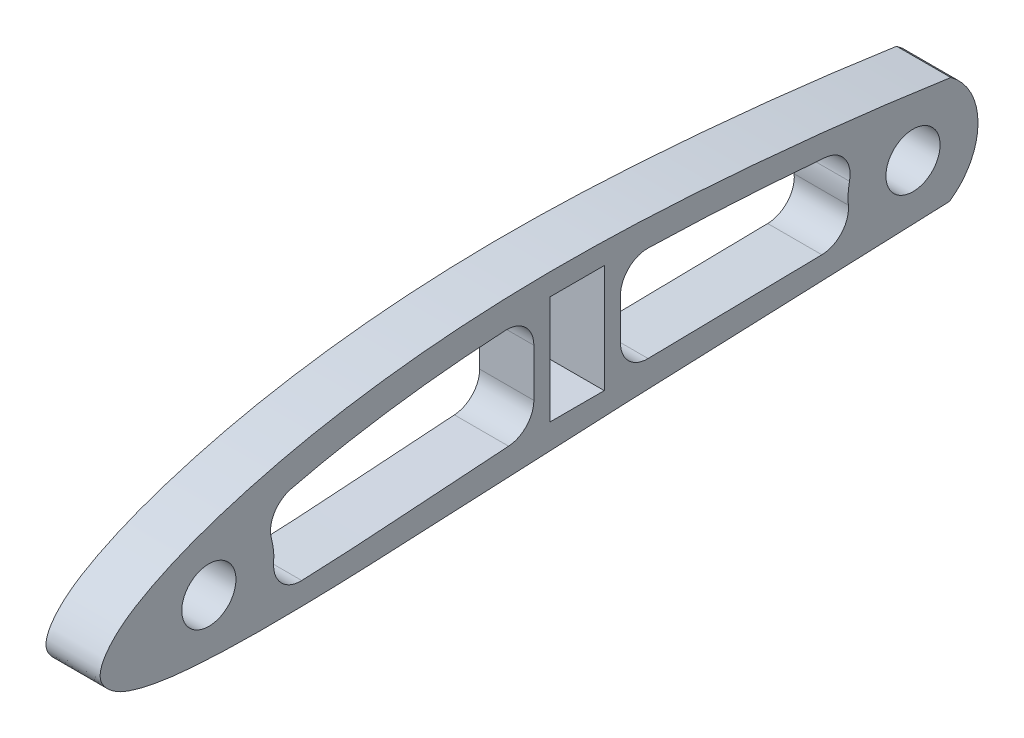
ISO-10303-21;
HEADER;
FILE_DESCRIPTION(('STEP AP214'),'2;1');
FILE_NAME('part.step','',(''),(''),'','','');
FILE_SCHEMA(('AUTOMOTIVE_DESIGN { 1 0 10303 214 1 1 1 1 }'));
ENDSEC;
DATA;
#1=APPLICATION_CONTEXT('core data for automotive mechanical design processes');
#2=APPLICATION_PROTOCOL_DEFINITION('international standard','automotive_design',2000,#1);
#3=PRODUCT_CONTEXT('',#1,'mechanical');
#4=PRODUCT('Part','Part','',(#3));
#5=PRODUCT_RELATED_PRODUCT_CATEGORY('part','',(#4));
#6=PRODUCT_DEFINITION_FORMATION('','',#4);
#7=PRODUCT_DEFINITION_CONTEXT('part definition',#1,'design');
#8=PRODUCT_DEFINITION('design','',#6,#7);
#9=PRODUCT_DEFINITION_SHAPE('','',#8);
#10=(LENGTH_UNIT() NAMED_UNIT(*) SI_UNIT(.MILLI.,.METRE.));
#11=(NAMED_UNIT(*) PLANE_ANGLE_UNIT() SI_UNIT($,.RADIAN.));
#12=(NAMED_UNIT(*) SI_UNIT($,.STERADIAN.) SOLID_ANGLE_UNIT());
#13=UNCERTAINTY_MEASURE_WITH_UNIT(LENGTH_MEASURE(1.E-05),#10,'distance_accuracy_value','');
#14=(GEOMETRIC_REPRESENTATION_CONTEXT(3) GLOBAL_UNCERTAINTY_ASSIGNED_CONTEXT((#13)) GLOBAL_UNIT_ASSIGNED_CONTEXT((#10,
#11,#12)) REPRESENTATION_CONTEXT('',''));
#15=CARTESIAN_POINT('',(0.,0.,0.));
#16=DIRECTION('',(0.,0.,1.));
#17=DIRECTION('',(1.,0.,0.));
#18=AXIS2_PLACEMENT_3D('',#15,#16,#17);
#19=CARTESIAN_POINT('',(5.,1.72884974399749,119.630810014965));
#20=DIRECTION('',(-1.,0.,0.));
#21=DIRECTION('',(0.,0.,1.));
#22=AXIS2_PLACEMENT_3D('',#19,#20,#21);
#23=PLANE('',#22);
#24=CARTESIAN_POINT('',(5.,4.15599999999999,45.));
#25=DIRECTION('',(1.,0.,0.));
#26=DIRECTION('',(0.,0.,-1.));
#27=AXIS2_PLACEMENT_3D('',#24,#25,#26);
#28=CIRCLE('',#27,2.5);
#29=CARTESIAN_POINT('',(5.,4.15599999999999,42.5));
#30=VERTEX_POINT('',#29);
#31=EDGE_CURVE('E317',#30,#30,#28,.T.);
#32=ORIENTED_EDGE('',*,*,#31,.F.);
#33=EDGE_LOOP('',(#32));
#34=FACE_BOUND('',#33,.T.);
#35=DIRECTION('',(0.,-1.,0.));
#36=VECTOR('',#35,1.);
#37=CARTESIAN_POINT('',(5.,9.4160000005453,72.0000000165505));
#38=LINE('',#37,#36);
#39=CARTESIAN_POINT('',(5.,6.87149134296159,72.0000000165505));
#40=VERTEX_POINT('',#39);
#41=CARTESIAN_POINT('',(5.,3.04404237860283,72.0000000165505));
#42=VERTEX_POINT('',#41);
#43=EDGE_CURVE('E710',#40,#42,#38,.T.);
#44=ORIENTED_EDGE('',*,*,#43,.F.);
#45=CARTESIAN_POINT('',(5.,6.87149134296159,69.5000000165505));
#46=DIRECTION('',(-1.,0.,0.));
#47=DIRECTION('',(0.,0.,1.));
#48=AXIS2_PLACEMENT_3D('',#45,#46,#47);
#49=CIRCLE('',#48,2.5);
#50=CARTESIAN_POINT('',(5.,9.37076401119251,69.4396996862533));
#51=VERTEX_POINT('',#50);
#52=EDGE_CURVE('E673',#40,#51,#49,.T.);
#53=ORIENTED_EDGE('',*,*,#52,.T.);
#54=CARTESIAN_POINT('',(5.,8.10999039938671,49.5128660429441));
#55=CARTESIAN_POINT('',(5.,8.44908110753721,52.9834214673197));
#56=CARTESIAN_POINT('',(5.,9.04683589836735,60.4711009068649));
#57=CARTESIAN_POINT('',(5.,9.3716584224983,67.9763818231858));
#58=CARTESIAN_POINT('',(5.,9.41600000054529,72.0000000165505));
#59=B_SPLINE_CURVE_WITH_KNOTS('',3,(#54,#55,#56,#57,#58),.UNSPECIFIED.,.F.,.F.,(4,1,4),
(0.206289006792082,0.248740009224029,0.297715538921779),.UNSPECIFIED.);
#60=CARTESIAN_POINT('',(5.,8.4381585753599,53.0961406415165));
#61=VERTEX_POINT('',#60);
#62=EDGE_CURVE('E707',#61,#51,#59,.T.);
#63=ORIENTED_EDGE('',*,*,#62,.F.);
#64=CARTESIAN_POINT('',(5.,5.94724692761963,53.3091175490718));
#65=DIRECTION('',(-1.,0.,0.));
#66=DIRECTION('',(0.,0.,1.));
#67=AXIS2_PLACEMENT_3D('',#64,#65,#66);
#68=CIRCLE('',#67,2.5);
#69=CARTESIAN_POINT('',(5.,5.4204095959668,50.8652594464036));
#70=VERTEX_POINT('',#69);
#71=EDGE_CURVE('E661',#61,#70,#68,.T.);
#72=ORIENTED_EDGE('',*,*,#71,.T.);
#73=CARTESIAN_POINT('',(5.,4.15599999999999,45.));
#74=DIRECTION('',(-1.,0.,0.));
#75=DIRECTION('',(0.,0.,-1.));
#76=AXIS2_PLACEMENT_3D('',#73,#74,#75);
#77=CIRCLE('',#76,5.99999999999999);
#78=CARTESIAN_POINT('',(5.,3.56444264728871,50.9707671113897));
#79=VERTEX_POINT('',#78);
#80=EDGE_CURVE('E316',#79,#70,#77,.T.);
#81=ORIENTED_EDGE('',*,*,#80,.F.);
#82=CARTESIAN_POINT('',(5.,3.31796041699234,53.4585867411354));
#83=DIRECTION('',(-1.,0.,0.));
#84=DIRECTION('',(0.,0.,1.));
#85=AXIS2_PLACEMENT_3D('',#82,#83,#84);
#86=CIRCLE('',#85,2.5);
#87=CARTESIAN_POINT('',(5.,0.818348024801849,53.4145652826437));
#88=VERTEX_POINT('',#87);
#89=EDGE_CURVE('E667',#79,#88,#86,.T.);
#90=ORIENTED_EDGE('',*,*,#89,.T.);
#91=CARTESIAN_POINT('',(5.,0.49599999929178,72.0000000165505));
#92=CARTESIAN_POINT('',(5.,0.575920017657169,68.011296659644));
#93=CARTESIAN_POINT('',(5.,0.684456618751358,60.6858216555381));
#94=CARTESIAN_POINT('',(5.,0.820935124692067,53.3608747879305));
#95=CARTESIAN_POINT('',(5.,0.876830129409983,50.0246437644687));
#96=B_SPLINE_CURVE_WITH_KNOTS('',3,(#91,#92,#93,#94,#95),.UNSPECIFIED.,.F.,.F.,(4,1,4),
(0.706558114024368,0.755481870433228,0.796400089162208),.UNSPECIFIED.);
#97=CARTESIAN_POINT('',(5.,0.544453867879172,69.4546428003848));
#98=VERTEX_POINT('',#97);
#99=EDGE_CURVE('E715',#98,#88,#96,.T.);
#100=ORIENTED_EDGE('',*,*,#99,.F.);
#101=CARTESIAN_POINT('',(5.,3.04404237860283,69.5000000165505));
#102=DIRECTION('',(-1.,0.,0.));
#103=DIRECTION('',(0.,0.,1.));
#104=AXIS2_PLACEMENT_3D('',#101,#102,#103);
#105=CIRCLE('',#104,2.5);
#106=EDGE_CURVE('E679',#98,#42,#105,.T.);
#107=ORIENTED_EDGE('',*,*,#106,.T.);
#108=EDGE_LOOP('',(#44,#53,#63,#72,#81,#90,#100,#107));
#109=FACE_BOUND('',#108,.T.);
#110=CARTESIAN_POINT('',(5.,1.90599999999999,110.));
#111=DIRECTION('',(-1.,0.,0.));
#112=DIRECTION('',(0.,0.,-1.));
#113=AXIS2_PLACEMENT_3D('',#110,#111,#112);
#114=CIRCLE('',#113,6.00000000000013);
#115=CARTESIAN_POINT('',(5.,3.50798474285004,104.217816598924));
#116=VERTEX_POINT('',#115);
#117=CARTESIAN_POINT('',(5.,1.46470049184479,104.016250778642));
#118=VERTEX_POINT('',#117);
#119=EDGE_CURVE('E702',#116,#118,#114,.T.);
#120=ORIENTED_EDGE('',*,*,#119,.F.);
#121=CARTESIAN_POINT('',(5.,4.17547838570421,101.808573515143));
#122=DIRECTION('',(-1.,0.,0.));
#123=DIRECTION('',(0.,0.,1.));
#124=AXIS2_PLACEMENT_3D('',#121,#122,#123);
#125=CIRCLE('',#124,2.5);
#126=CARTESIAN_POINT('',(5.,6.60323541378304,102.405227361702));
#127=VERTEX_POINT('',#126);
#128=EDGE_CURVE('E599',#116,#127,#125,.T.);
#129=ORIENTED_EDGE('',*,*,#128,.T.);
#130=CARTESIAN_POINT('',(5.,9.49104174368921,80.0000000000001));
#131=CARTESIAN_POINT('',(5.,9.44612125335728,81.3210998807206));
#132=CARTESIAN_POINT('',(5.,9.28767536080287,84.6261834175157));
#133=CARTESIAN_POINT('',(5.,8.82784138555909,89.9128007088754));
#134=CARTESIAN_POINT('',(5.,7.99992590589666,95.8549777814982));
#135=CARTESIAN_POINT('',(5.,6.97959621859254,101.037837975751));
#136=CARTESIAN_POINT('',(5.,6.14686734531858,104.212985807448));
#137=CARTESIAN_POINT('',(5.,5.79482372136699,105.430858935846));
#138=B_SPLINE_CURVE_WITH_KNOTS('',3,(#130,#131,#132,#133,#134,#135,#136,#137),.UNSPECIFIED.,.F.,
.F.,(4,1,1,1,1,4),(0.330300010154575,0.346600594361287,0.371102737044854,0.395726297170324,
0.420570145356384,0.43620225213534),.UNSPECIFIED.);
#139=CARTESIAN_POINT('',(5.,9.3765069262802,82.6329258266078));
#140=VERTEX_POINT('',#139);
#141=EDGE_CURVE('E785',#140,#127,#138,.T.);
#142=ORIENTED_EDGE('',*,*,#141,.F.);
#143=CARTESIAN_POINT('',(5.,6.88004328251916,82.5000000000001));
#144=DIRECTION('',(-1.,0.,0.));
#145=DIRECTION('',(0.,0.,1.));
#146=AXIS2_PLACEMENT_3D('',#143,#144,#145);
#147=CIRCLE('',#146,2.5);
#148=CARTESIAN_POINT('',(5.,6.88004328251916,80.0000000000001));
#149=VERTEX_POINT('',#148);
#150=EDGE_CURVE('E685',#140,#149,#147,.T.);
#151=ORIENTED_EDGE('',*,*,#150,.T.);
#152=DIRECTION('',(0.,1.,0.));
#153=VECTOR('',#152,1.);
#154=CARTESIAN_POINT('',(5.,9.49104174368921,80.0000000000001));
#155=LINE('',#154,#153);
#156=CARTESIAN_POINT('',(5.,2.47124174526114,80.0000000000001));
#157=VERTEX_POINT('',#156);
#158=EDGE_CURVE('E359',#157,#149,#155,.T.);
#159=ORIENTED_EDGE('',*,*,#158,.F.);
#160=CARTESIAN_POINT('',(5.,2.47124174526114,82.5000000000001));
#161=DIRECTION('',(-1.,0.,0.));
#162=DIRECTION('',(0.,0.,1.));
#163=AXIS2_PLACEMENT_3D('',#160,#161,#162);
#164=CIRCLE('',#163,2.5);
#165=CARTESIAN_POINT('',(5.,-0.0231651414838941,82.3328644760713));
#166=VERTEX_POINT('',#165);
#167=EDGE_CURVE('E51',#157,#166,#164,.T.);
#168=ORIENTED_EDGE('',*,*,#167,.T.);
#169=CARTESIAN_POINT('',(5.,-1.32230010540803,104.942522523093));
#170=CARTESIAN_POINT('',(5.,-1.30451309347742,104.028445120307));
#171=CARTESIAN_POINT('',(5.,-1.21842873574873,101.094064778039));
#172=CARTESIAN_POINT('',(5.,-0.982427522362044,96.1412070982545));
#173=CARTESIAN_POINT('',(5.,-0.54051718118655,90.0906445361081));
#174=CARTESIAN_POINT('',(5.,-0.182788772949806,84.7088661352887));
#175=CARTESIAN_POINT('',(5.,0.0431288670400443,81.3453939125052));
#176=CARTESIAN_POINT('',(5.,0.132962651031432,80.0000000000001));
#177=B_SPLINE_CURVE_WITH_KNOTS('',3,(#169,#170,#171,#172,#173,#174,#175,#176),.UNSPECIFIED.,.F.,
.F.,(4,1,1,1,1,4),(0.57316862998742,0.584228898401235,0.608680810066395,0.633151283581104,
0.657621757095813,0.673934786748305),.UNSPECIFIED.);
#178=CARTESIAN_POINT('',(5.,-1.21734689174811,101.42745144972));
#179=VERTEX_POINT('',#178);
#180=EDGE_CURVE('E696',#179,#166,#177,.T.);
#181=ORIENTED_EDGE('',*,*,#180,.F.);
#182=CARTESIAN_POINT('',(5.,1.28082569678013,101.52302193641));
#183=DIRECTION('',(-1.,0.,0.));
#184=DIRECTION('',(0.,0.,1.));
#185=AXIS2_PLACEMENT_3D('',#182,#183,#184);
#186=CIRCLE('',#185,2.5);
#187=EDGE_CURVE('E655',#179,#118,#186,.T.);
#188=ORIENTED_EDGE('',*,*,#187,.T.);
#189=EDGE_LOOP('',(#120,#129,#142,#151,#159,#168,#181,#188));
#190=FACE_BOUND('',#189,.T.);
#191=CARTESIAN_POINT('',(5.,1.90599999999999,110.));
#192=DIRECTION('',(1.,0.,0.));
#193=DIRECTION('',(0.,0.,-1.));
#194=AXIS2_PLACEMENT_3D('',#191,#192,#193);
#195=CIRCLE('',#194,2.5);
#196=CARTESIAN_POINT('',(5.,1.90599999999999,107.5));
#197=VERTEX_POINT('',#196);
#198=EDGE_CURVE('E217',#197,#197,#195,.T.);
#199=ORIENTED_EDGE('',*,*,#198,.F.);
#200=EDGE_LOOP('',(#199));
#201=FACE_BOUND('',#200,.T.);
#202=DIRECTION('',(0.,0.,1.));
#203=VECTOR('',#202,1.);
#204=CARTESIAN_POINT('',(5.,10.,78.5000000082753));
#205=LINE('',#204,#203);
#206=CARTESIAN_POINT('',(5.,10.,73.5000000082753));
#207=VERTEX_POINT('',#206);
#208=CARTESIAN_POINT('',(5.,10.,78.5000000082753));
#209=VERTEX_POINT('',#208);
#210=EDGE_CURVE('E813',#207,#209,#205,.T.);
#211=ORIENTED_EDGE('',*,*,#210,.F.);
#212=DIRECTION('',(0.,1.,0.));
#213=VECTOR('',#212,1.);
#214=CARTESIAN_POINT('',(5.,10.,73.5000000082753));
#215=LINE('',#214,#213);
#216=CARTESIAN_POINT('',(5.,0.,73.5000000082753));
#217=VERTEX_POINT('',#216);
#218=EDGE_CURVE('E208',#217,#207,#215,.T.);
#219=ORIENTED_EDGE('',*,*,#218,.F.);
#220=DIRECTION('',(0.,0.,-1.));
#221=VECTOR('',#220,1.);
#222=CARTESIAN_POINT('',(5.,0.,78.5000000082753));
#223=LINE('',#222,#221);
#224=CARTESIAN_POINT('',(5.,0.,78.5000000082753));
#225=VERTEX_POINT('',#224);
#226=EDGE_CURVE('E768',#225,#217,#223,.T.);
#227=ORIENTED_EDGE('',*,*,#226,.F.);
#228=DIRECTION('',(0.,-1.,0.));
#229=VECTOR('',#228,1.);
#230=CARTESIAN_POINT('',(5.,10.,78.5000000082753));
#231=LINE('',#230,#229);
#232=EDGE_CURVE('E816',#209,#225,#231,.T.);
#233=ORIENTED_EDGE('',*,*,#232,.F.);
#234=EDGE_LOOP('',(#211,#219,#227,#233));
#235=FACE_BOUND('',#234,.T.);
#236=CARTESIAN_POINT('',(5.,0.312,0.));
#237=CARTESIAN_POINT('',(5.,0.855883828599378,1.99793796168733));
#238=CARTESIAN_POINT('',(5.,1.94102677438063,5.98417210072547));
#239=CARTESIAN_POINT('',(5.,3.91408432771434,13.9697544761585));
#240=CARTESIAN_POINT('',(5.,6.09407294427039,23.9560004638239));
#241=CARTESIAN_POINT('',(5.,8.24302021851501,35.9675561143228));
#242=CARTESIAN_POINT('',(5.,10.0044877062511,47.9698001372082));
#243=CARTESIAN_POINT('',(5.,11.2609415120576,59.9787317032797));
#244=CARTESIAN_POINT('',(5.,12.0445796046976,71.9866169180381));
#245=CARTESIAN_POINT('',(5.,12.0525049214461,82.0109437288182));
#246=CARTESIAN_POINT('',(5.,11.4987714119754,90.0148016304753));
#247=CARTESIAN_POINT('',(5.,10.7694046945803,96.0258054343796));
#248=CARTESIAN_POINT('',(5.,9.69380040806095,102.049800649444));
#249=CARTESIAN_POINT('',(5.,8.40023368687852,107.041673172646));
#250=CARTESIAN_POINT('',(5.,7.09378518386288,111.041923446385));
#251=CARTESIAN_POINT('',(5.,5.86043741449779,114.058204625779));
#252=CARTESIAN_POINT('',(5.,4.52660437231522,116.631860078189));
#253=CARTESIAN_POINT('',(5.,2.93110483959078,118.865795121809));
#254=CARTESIAN_POINT('',(5.,0.365036715263485,120.810450077977));
#255=CARTESIAN_POINT('',(5.,-1.59743941936127,118.711450949547));
#256=CARTESIAN_POINT('',(5.,-2.36778428116419,116.569629864534));
#257=CARTESIAN_POINT('',(5.,-2.88773314535719,114.018868253207));
#258=CARTESIAN_POINT('',(5.,-3.15208970478753,111.006425111535));
#259=CARTESIAN_POINT('',(5.,-3.33918004681278,107.00166314421));
#260=CARTESIAN_POINT('',(5.,-3.32516685305854,101.99874769137));
#261=CARTESIAN_POINT('',(5.,-3.15722898094636,95.9973958230413));
#262=CARTESIAN_POINT('',(5.,-2.83746399904718,90.0002784691852));
#263=CARTESIAN_POINT('',(5.,-2.46330841463188,82.0002471015889));
#264=CARTESIAN_POINT('',(5.,-1.98316600917488,72.0019156217619));
#265=CARTESIAN_POINT('',(5.,-1.53230854406341,59.9996539113914));
#266=CARTESIAN_POINT('',(5.,-1.03166976288166,48.0012478764336));
#267=CARTESIAN_POINT('',(5.,-0.605253894721018,36.0016937698003));
#268=CARTESIAN_POINT('',(5.,-0.291598270453278,24.0011783465454));
#269=CARTESIAN_POINT('',(5.,-0.132346287230114,14.0003002940533));
#270=CARTESIAN_POINT('',(5.,-0.0274706292626276,6.00018239265294));
#271=CARTESIAN_POINT('',(5.,-0.00915671161044935,2.00002479937245));
#272=CARTESIAN_POINT('',(5.,0.,0.));
#273=B_SPLINE_CURVE_WITH_KNOTS('',3,(#236,#237,#238,#239,#240,#241,#242,#243,#244,#245,#246,
#247,#248,#249,#250,#251,#252,#253,#254,#255,#256,#257,#258,#259,#260,#261,#262,#263,#264,#265,
#266,#267,#268,#269,#270,#271,#272),.UNSPECIFIED.,.F.,.F.,(4,1,1,1,1,1,1,1,1,1,1,1,1,1,1,1,1,1,
1,1,1,1,1,1,1,1,1,1,1,1,1,1,1,1,4),(0.,0.0253048857109568,0.0504876533905407,0.100520432651506,
0.150190715723339,0.199586606894546,0.248740009224029,0.297715538989186,0.346600594361287,
0.371102737044854,0.395726297170324,0.420570145356384,0.445825119255769,0.458702215791061,
0.471919981785349,0.485786002851729,0.493461050828321,0.506863029175844,0.516147770049506,
0.522766002591757,0.535269014058866,0.54755113395783,0.559786370715185,0.584228898401235,
0.608680810066395,0.633151283581104,0.657621757095813,0.706558114036031,0.755481870433228,
0.804405626830425,0.853320223819576,0.902221408341012,0.951113135961066,0.975557227893806,1.),.UNSPECIFIED.);
#274=CARTESIAN_POINT('',(5.,9.03853314424988,41.5127560889292));
#275=VERTEX_POINT('',#274);
#276=CARTESIAN_POINT('',(5.,-0.809415975842715,41.6318188607435));
#277=VERTEX_POINT('',#276);
#278=EDGE_CURVE('E204',#275,#277,#273,.T.);
#279=ORIENTED_EDGE('',*,*,#278,.T.);
#280=CARTESIAN_POINT('',(5.,4.15599999999999,45.));
#281=DIRECTION('',(-1.,0.,0.));
#282=DIRECTION('',(0.,0.,-1.));
#283=AXIS2_PLACEMENT_3D('',#280,#281,#282);
#284=CIRCLE('',#283,5.99999999999991);
#285=EDGE_CURVE('E191',#275,#277,#284,.T.);
#286=ORIENTED_EDGE('',*,*,#285,.F.);
#287=EDGE_LOOP('',(#279,#286));
#288=FACE_BOUND('',#287,.T.);
#289=ADVANCED_FACE('F42',(#34,#109,#190,#201,#235,#288),#23,.F.);
#290=CARTESIAN_POINT('',(0.,1.72884974399749,119.630810014965));
#291=DIRECTION('',(-1.,0.,0.));
#292=DIRECTION('',(0.,0.,1.));
#293=AXIS2_PLACEMENT_3D('',#290,#291,#292);
#294=PLANE('',#293);
#295=CARTESIAN_POINT('',(0.,4.15599999999999,45.));
#296=DIRECTION('',(1.,0.,0.));
#297=DIRECTION('',(0.,0.,-1.));
#298=AXIS2_PLACEMENT_3D('',#295,#296,#297);
#299=CIRCLE('',#298,2.5);
#300=CARTESIAN_POINT('',(0.,4.15599999999999,42.5));
#301=VERTEX_POINT('',#300);
#302=EDGE_CURVE('E223',#301,#301,#299,.T.);
#303=ORIENTED_EDGE('',*,*,#302,.T.);
#304=EDGE_LOOP('',(#303));
#305=FACE_BOUND('',#304,.T.);
#306=CARTESIAN_POINT('',(0.,4.15599999999999,45.));
#307=DIRECTION('',(-1.,0.,0.));
#308=DIRECTION('',(0.,0.,-1.));
#309=AXIS2_PLACEMENT_3D('',#306,#307,#308);
#310=CIRCLE('',#309,5.99999999999999);
#311=CARTESIAN_POINT('',(0.,3.56444264728871,50.9707671113897));
#312=VERTEX_POINT('',#311);
#313=CARTESIAN_POINT('',(0.,5.4204095959668,50.8652594464036));
#314=VERTEX_POINT('',#313);
#315=EDGE_CURVE('E302',#312,#314,#310,.T.);
#316=ORIENTED_EDGE('',*,*,#315,.T.);
#317=CARTESIAN_POINT('',(0.,5.94724692761963,53.3091175490718));
#318=DIRECTION('',(-1.,0.,0.));
#319=DIRECTION('',(0.,0.,1.));
#320=AXIS2_PLACEMENT_3D('',#317,#318,#319);
#321=CIRCLE('',#320,2.5);
#322=CARTESIAN_POINT('',(0.,8.4381585753599,53.0961406415165));
#323=VERTEX_POINT('',#322);
#324=EDGE_CURVE('E664',#314,#323,#321,.F.);
#325=ORIENTED_EDGE('',*,*,#324,.T.);
#326=CARTESIAN_POINT('',(0.,8.10999039938671,49.5128660429441));
#327=CARTESIAN_POINT('',(0.,8.44908110753721,52.9834214673197));
#328=CARTESIAN_POINT('',(0.,9.04683589836735,60.4711009068649));
#329=CARTESIAN_POINT('',(0.,9.3716584224983,67.9763818231858));
#330=CARTESIAN_POINT('',(0.,9.41600000054529,72.0000000165505));
#331=B_SPLINE_CURVE_WITH_KNOTS('',3,(#326,#327,#328,#329,#330),.UNSPECIFIED.,.F.,.F.,(4,1,4),
(0.206289006792082,0.248740009224029,0.297715538921779),.UNSPECIFIED.);
#332=CARTESIAN_POINT('',(0.,9.37076401119251,69.4396996862533));
#333=VERTEX_POINT('',#332);
#334=EDGE_CURVE('E310',#323,#333,#331,.T.);
#335=ORIENTED_EDGE('',*,*,#334,.T.);
#336=CARTESIAN_POINT('',(0.,6.87149134296159,69.5000000165505));
#337=DIRECTION('',(-1.,0.,0.));
#338=DIRECTION('',(0.,0.,1.));
#339=AXIS2_PLACEMENT_3D('',#336,#337,#338);
#340=CIRCLE('',#339,2.5);
#341=CARTESIAN_POINT('',(0.,6.87149134296159,72.0000000165505));
#342=VERTEX_POINT('',#341);
#343=EDGE_CURVE('E676',#333,#342,#340,.F.);
#344=ORIENTED_EDGE('',*,*,#343,.T.);
#345=DIRECTION('',(0.,-1.,0.));
#346=VECTOR('',#345,1.);
#347=CARTESIAN_POINT('',(0.,9.4160000005453,72.0000000165505));
#348=LINE('',#347,#346);
#349=CARTESIAN_POINT('',(0.,3.04404237860283,72.0000000165505));
#350=VERTEX_POINT('',#349);
#351=EDGE_CURVE('E301',#342,#350,#348,.T.);
#352=ORIENTED_EDGE('',*,*,#351,.T.);
#353=CARTESIAN_POINT('',(0.,3.04404237860283,69.5000000165505));
#354=DIRECTION('',(-1.,0.,0.));
#355=DIRECTION('',(0.,0.,1.));
#356=AXIS2_PLACEMENT_3D('',#353,#354,#355);
#357=CIRCLE('',#356,2.5);
#358=CARTESIAN_POINT('',(0.,0.544453867879172,69.4546428003848));
#359=VERTEX_POINT('',#358);
#360=EDGE_CURVE('E682',#350,#359,#357,.F.);
#361=ORIENTED_EDGE('',*,*,#360,.T.);
#362=CARTESIAN_POINT('',(0.,0.49599999929178,72.0000000165505));
#363=CARTESIAN_POINT('',(0.,0.575920017657169,68.011296659644));
#364=CARTESIAN_POINT('',(0.,0.684456618751358,60.6858216555381));
#365=CARTESIAN_POINT('',(0.,0.820935124692067,53.3608747879305));
#366=CARTESIAN_POINT('',(0.,0.876830129409983,50.0246437644687));
#367=B_SPLINE_CURVE_WITH_KNOTS('',3,(#362,#363,#364,#365,#366),.UNSPECIFIED.,.F.,.F.,(4,1,4),
(0.706558114024368,0.755481870433228,0.796400089162208),.UNSPECIFIED.);
#368=CARTESIAN_POINT('',(0.,0.818348024801849,53.4145652826437));
#369=VERTEX_POINT('',#368);
#370=EDGE_CURVE('E293',#359,#369,#367,.T.);
#371=ORIENTED_EDGE('',*,*,#370,.T.);
#372=CARTESIAN_POINT('',(0.,3.31796041699234,53.4585867411354));
#373=DIRECTION('',(-1.,0.,0.));
#374=DIRECTION('',(0.,0.,1.));
#375=AXIS2_PLACEMENT_3D('',#372,#373,#374);
#376=CIRCLE('',#375,2.5);
#377=EDGE_CURVE('E670',#369,#312,#376,.F.);
#378=ORIENTED_EDGE('',*,*,#377,.T.);
#379=EDGE_LOOP('',(#316,#325,#335,#344,#352,#361,#371,#378));
#380=FACE_BOUND('',#379,.T.);
#381=DIRECTION('',(0.,1.,0.));
#382=VECTOR('',#381,1.);
#383=CARTESIAN_POINT('',(0.,9.49104174368921,80.0000000000001));
#384=LINE('',#383,#382);
#385=CARTESIAN_POINT('',(0.,2.47124174526114,80.0000000000001));
#386=VERTEX_POINT('',#385);
#387=CARTESIAN_POINT('',(0.,6.88004328251916,80.0000000000001));
#388=VERTEX_POINT('',#387);
#389=EDGE_CURVE('E344',#386,#388,#384,.T.);
#390=ORIENTED_EDGE('',*,*,#389,.T.);
#391=CARTESIAN_POINT('',(0.,6.88004328251916,82.5000000000001));
#392=DIRECTION('',(-1.,0.,0.));
#393=DIRECTION('',(0.,0.,1.));
#394=AXIS2_PLACEMENT_3D('',#391,#392,#393);
#395=CIRCLE('',#394,2.5);
#396=CARTESIAN_POINT('',(0.,9.3765069262802,82.6329258266078));
#397=VERTEX_POINT('',#396);
#398=EDGE_CURVE('E688',#388,#397,#395,.F.);
#399=ORIENTED_EDGE('',*,*,#398,.T.);
#400=CARTESIAN_POINT('',(0.,9.49104174368921,80.0000000000001));
#401=CARTESIAN_POINT('',(0.,9.44612125335728,81.3210998807206));
#402=CARTESIAN_POINT('',(0.,9.28767536080287,84.6261834175157));
#403=CARTESIAN_POINT('',(0.,8.82784138555909,89.9128007088754));
#404=CARTESIAN_POINT('',(0.,7.99992590589666,95.8549777814982));
#405=CARTESIAN_POINT('',(0.,6.97959621859254,101.037837975751));
#406=CARTESIAN_POINT('',(0.,6.14686734531858,104.212985807448));
#407=CARTESIAN_POINT('',(0.,5.79482372136699,105.430858935846));
#408=B_SPLINE_CURVE_WITH_KNOTS('',3,(#400,#401,#402,#403,#404,#405,#406,#407),.UNSPECIFIED.,.F.,
.F.,(4,1,1,1,1,4),(0.330300010154575,0.346600594361287,0.371102737044854,0.395726297170324,
0.420570145356384,0.43620225213534),.UNSPECIFIED.);
#409=CARTESIAN_POINT('',(0.,6.60323541378304,102.405227361702));
#410=VERTEX_POINT('',#409);
#411=EDGE_CURVE('E352',#397,#410,#408,.T.);
#412=ORIENTED_EDGE('',*,*,#411,.T.);
#413=CARTESIAN_POINT('',(0.,4.17547838570421,101.808573515143));
#414=DIRECTION('',(-1.,0.,0.));
#415=DIRECTION('',(0.,0.,1.));
#416=AXIS2_PLACEMENT_3D('',#413,#414,#415);
#417=CIRCLE('',#416,2.5);
#418=CARTESIAN_POINT('',(0.,3.50798474285004,104.217816598924));
#419=VERTEX_POINT('',#418);
#420=EDGE_CURVE('E598',#410,#419,#417,.F.);
#421=ORIENTED_EDGE('',*,*,#420,.T.);
#422=CARTESIAN_POINT('',(0.,1.90599999999999,110.));
#423=DIRECTION('',(-1.,0.,0.));
#424=DIRECTION('',(0.,0.,-1.));
#425=AXIS2_PLACEMENT_3D('',#422,#423,#424);
#426=CIRCLE('',#425,6.00000000000013);
#427=CARTESIAN_POINT('',(0.,1.46470049184479,104.016250778642));
#428=VERTEX_POINT('',#427);
#429=EDGE_CURVE('E343',#419,#428,#426,.T.);
#430=ORIENTED_EDGE('',*,*,#429,.T.);
#431=CARTESIAN_POINT('',(0.,1.28082569678013,101.52302193641));
#432=DIRECTION('',(-1.,0.,0.));
#433=DIRECTION('',(0.,0.,1.));
#434=AXIS2_PLACEMENT_3D('',#431,#432,#433);
#435=CIRCLE('',#434,2.5);
#436=CARTESIAN_POINT('',(0.,-1.21734689174811,101.42745144972));
#437=VERTEX_POINT('',#436);
#438=EDGE_CURVE('E658',#428,#437,#435,.F.);
#439=ORIENTED_EDGE('',*,*,#438,.T.);
#440=CARTESIAN_POINT('',(0.,-1.32230010540803,104.942522523093));
#441=CARTESIAN_POINT('',(0.,-1.30451309347742,104.028445120307));
#442=CARTESIAN_POINT('',(0.,-1.21842873574873,101.094064778039));
#443=CARTESIAN_POINT('',(0.,-0.982427522362044,96.1412070982545));
#444=CARTESIAN_POINT('',(0.,-0.54051718118655,90.0906445361081));
#445=CARTESIAN_POINT('',(0.,-0.182788772949806,84.7088661352887));
#446=CARTESIAN_POINT('',(0.,0.0431288670400443,81.3453939125052));
#447=CARTESIAN_POINT('',(0.,0.132962651031432,80.0000000000001));
#448=B_SPLINE_CURVE_WITH_KNOTS('',3,(#440,#441,#442,#443,#444,#445,#446,#447),.UNSPECIFIED.,.F.,
.F.,(4,1,1,1,1,4),(0.57316862998742,0.584228898401235,0.608680810066395,0.633151283581104,
0.657621757095813,0.673934786748305),.UNSPECIFIED.);
#449=CARTESIAN_POINT('',(0.,-0.0231651414838941,82.3328644760713));
#450=VERTEX_POINT('',#449);
#451=EDGE_CURVE('E335',#437,#450,#448,.T.);
#452=ORIENTED_EDGE('',*,*,#451,.T.);
#453=CARTESIAN_POINT('',(0.,2.47124174526114,82.5000000000001));
#454=DIRECTION('',(-1.,0.,0.));
#455=DIRECTION('',(0.,0.,1.));
#456=AXIS2_PLACEMENT_3D('',#453,#454,#455);
#457=CIRCLE('',#456,2.5);
#458=EDGE_CURVE('E11',#450,#386,#457,.F.);
#459=ORIENTED_EDGE('',*,*,#458,.T.);
#460=EDGE_LOOP('',(#390,#399,#412,#421,#430,#439,#452,#459));
#461=FACE_BOUND('',#460,.T.);
#462=CARTESIAN_POINT('',(0.,1.90599999999999,110.));
#463=DIRECTION('',(1.,0.,0.));
#464=DIRECTION('',(0.,0.,-1.));
#465=AXIS2_PLACEMENT_3D('',#462,#463,#464);
#466=CIRCLE('',#465,2.5);
#467=CARTESIAN_POINT('',(0.,1.90599999999999,107.5));
#468=VERTEX_POINT('',#467);
#469=EDGE_CURVE('E781',#468,#468,#466,.T.);
#470=ORIENTED_EDGE('',*,*,#469,.T.);
#471=EDGE_LOOP('',(#470));
#472=FACE_BOUND('',#471,.T.);
#473=DIRECTION('',(0.,1.,0.));
#474=VECTOR('',#473,1.);
#475=CARTESIAN_POINT('',(0.,10.,73.5000000082753));
#476=LINE('',#475,#474);
#477=CARTESIAN_POINT('',(0.,0.,73.5000000082753));
#478=VERTEX_POINT('',#477);
#479=CARTESIAN_POINT('',(0.,10.,73.5000000082753));
#480=VERTEX_POINT('',#479);
#481=EDGE_CURVE('E835',#478,#480,#476,.T.);
#482=ORIENTED_EDGE('',*,*,#481,.T.);
#483=DIRECTION('',(0.,0.,1.));
#484=VECTOR('',#483,1.);
#485=CARTESIAN_POINT('',(0.,10.,78.5000000082753));
#486=LINE('',#485,#484);
#487=CARTESIAN_POINT('',(0.,10.,78.5000000082753));
#488=VERTEX_POINT('',#487);
#489=EDGE_CURVE('E831',#480,#488,#486,.T.);
#490=ORIENTED_EDGE('',*,*,#489,.T.);
#491=DIRECTION('',(0.,-1.,0.));
#492=VECTOR('',#491,1.);
#493=CARTESIAN_POINT('',(0.,10.,78.5000000082753));
#494=LINE('',#493,#492);
#495=CARTESIAN_POINT('',(0.,0.,78.5000000082753));
#496=VERTEX_POINT('',#495);
#497=EDGE_CURVE('E827',#488,#496,#494,.T.);
#498=ORIENTED_EDGE('',*,*,#497,.T.);
#499=DIRECTION('',(0.,0.,-1.));
#500=VECTOR('',#499,1.);
#501=CARTESIAN_POINT('',(0.,0.,78.5000000082753));
#502=LINE('',#501,#500);
#503=EDGE_CURVE('E777',#496,#478,#502,.T.);
#504=ORIENTED_EDGE('',*,*,#503,.T.);
#505=EDGE_LOOP('',(#482,#490,#498,#504));
#506=FACE_BOUND('',#505,.T.);
#507=CARTESIAN_POINT('',(0.,4.15599999999999,45.));
#508=DIRECTION('',(-1.,0.,0.));
#509=DIRECTION('',(0.,0.,-1.));
#510=AXIS2_PLACEMENT_3D('',#507,#508,#509);
#511=CIRCLE('',#510,5.99999999999991);
#512=CARTESIAN_POINT('',(0.,9.03853314424988,41.5127560889292));
#513=VERTEX_POINT('',#512);
#514=CARTESIAN_POINT('',(0.,-0.809415975842655,41.6318188607418));
#515=VERTEX_POINT('',#514);
#516=EDGE_CURVE('E199',#513,#515,#511,.T.);
#517=ORIENTED_EDGE('',*,*,#516,.T.);
#518=CARTESIAN_POINT('',(0.,0.312,0.));
#519=CARTESIAN_POINT('',(0.,0.855883828599378,1.99793796168733));
#520=CARTESIAN_POINT('',(0.,1.94102677438063,5.98417210072547));
#521=CARTESIAN_POINT('',(0.,3.91408432771434,13.9697544761585));
#522=CARTESIAN_POINT('',(0.,6.09407294427039,23.9560004638239));
#523=CARTESIAN_POINT('',(0.,8.24302021851501,35.9675561143228));
#524=CARTESIAN_POINT('',(0.,10.0044877062511,47.9698001372082));
#525=CARTESIAN_POINT('',(0.,11.2609415120576,59.9787317032797));
#526=CARTESIAN_POINT('',(0.,12.0445796046976,71.9866169180381));
#527=CARTESIAN_POINT('',(0.,12.0525049214461,82.0109437288182));
#528=CARTESIAN_POINT('',(0.,11.4987714119754,90.0148016304753));
#529=CARTESIAN_POINT('',(0.,10.7694046945803,96.0258054343796));
#530=CARTESIAN_POINT('',(0.,9.69380040806095,102.049800649444));
#531=CARTESIAN_POINT('',(0.,8.40023368687852,107.041673172646));
#532=CARTESIAN_POINT('',(0.,7.09378518386288,111.041923446385));
#533=CARTESIAN_POINT('',(0.,5.86043741449779,114.058204625779));
#534=CARTESIAN_POINT('',(0.,4.52660437231522,116.631860078189));
#535=CARTESIAN_POINT('',(0.,2.93110483959078,118.865795121809));
#536=CARTESIAN_POINT('',(0.,0.365036715263485,120.810450077977));
#537=CARTESIAN_POINT('',(0.,-1.59743941936127,118.711450949547));
#538=CARTESIAN_POINT('',(0.,-2.36778428116419,116.569629864534));
#539=CARTESIAN_POINT('',(0.,-2.88773314535719,114.018868253207));
#540=CARTESIAN_POINT('',(0.,-3.15208970478753,111.006425111535));
#541=CARTESIAN_POINT('',(0.,-3.33918004681278,107.00166314421));
#542=CARTESIAN_POINT('',(0.,-3.32516685305854,101.99874769137));
#543=CARTESIAN_POINT('',(0.,-3.15722898094636,95.9973958230413));
#544=CARTESIAN_POINT('',(0.,-2.83746399904718,90.0002784691852));
#545=CARTESIAN_POINT('',(0.,-2.46330841463188,82.0002471015889));
#546=CARTESIAN_POINT('',(0.,-1.98316600917488,72.0019156217619));
#547=CARTESIAN_POINT('',(0.,-1.53230854406341,59.9996539113914));
#548=CARTESIAN_POINT('',(0.,-1.03166976288166,48.0012478764336));
#549=CARTESIAN_POINT('',(0.,-0.605253894721018,36.0016937698003));
#550=CARTESIAN_POINT('',(0.,-0.291598270453278,24.0011783465454));
#551=CARTESIAN_POINT('',(0.,-0.132346287230114,14.0003002940533));
#552=CARTESIAN_POINT('',(0.,-0.0274706292626276,6.00018239265294));
#553=CARTESIAN_POINT('',(0.,-0.00915671161044935,2.00002479937245));
#554=CARTESIAN_POINT('',(0.,0.,0.));
#555=B_SPLINE_CURVE_WITH_KNOTS('',3,(#518,#519,#520,#521,#522,#523,#524,#525,#526,#527,#528,
#529,#530,#531,#532,#533,#534,#535,#536,#537,#538,#539,#540,#541,#542,#543,#544,#545,#546,#547,
#548,#549,#550,#551,#552,#553,#554),.UNSPECIFIED.,.F.,.F.,(4,1,1,1,1,1,1,1,1,1,1,1,1,1,1,1,1,1,
1,1,1,1,1,1,1,1,1,1,1,1,1,1,1,1,4),(0.,0.0253048857109568,0.0504876533905407,0.100520432651506,
0.150190715723339,0.199586606894546,0.248740009224029,0.297715538989186,0.346600594361287,
0.371102737044854,0.395726297170324,0.420570145356384,0.445825119255769,0.458702215791061,
0.471919981785349,0.485786002851729,0.493461050828321,0.506863029175844,0.516147770049506,
0.522766002591757,0.535269014058866,0.54755113395783,0.559786370715185,0.584228898401235,
0.608680810066395,0.633151283581104,0.657621757095813,0.706558114036031,0.755481870433228,
0.804405626830425,0.853320223819576,0.902221408341012,0.951113135961066,0.975557227893806,1.),.UNSPECIFIED.);
#556=EDGE_CURVE('E206',#513,#515,#555,.T.);
#557=ORIENTED_EDGE('',*,*,#556,.F.);
#558=EDGE_LOOP('',(#517,#557));
#559=FACE_BOUND('',#558,.T.);
#560=ADVANCED_FACE('F235',(#305,#380,#461,#472,#506,#559),#294,.T.);
#561=DIRECTION('',(-1.,0.,0.));
#562=VECTOR('',#561,1.);
#563=SURFACE_OF_LINEAR_EXTRUSION('',#273,#562);
#564=ORIENTED_EDGE('',*,*,#278,.F.);
#565=DIRECTION('',(-1.,0.,0.));
#566=VECTOR('',#565,1.);
#567=CARTESIAN_POINT('',(2.5,9.03853314424988,41.5127560889292));
#568=LINE('',#567,#566);
#569=EDGE_CURVE('E194',#513,#275,#568,.F.);
#570=ORIENTED_EDGE('',*,*,#569,.F.);
#571=ORIENTED_EDGE('',*,*,#556,.T.);
#572=DIRECTION('',(-1.,0.,0.));
#573=VECTOR('',#572,1.);
#574=CARTESIAN_POINT('',(2.5,-0.809415975842705,41.6318188607432));
#575=LINE('',#574,#573);
#576=EDGE_CURVE('E58',#515,#277,#575,.F.);
#577=ORIENTED_EDGE('',*,*,#576,.T.);
#578=EDGE_LOOP('',(#564,#570,#571,#577));
#579=FACE_BOUND('',#578,.T.);
#580=ADVANCED_FACE('F203',(#579),#563,.F.);
#581=CARTESIAN_POINT('',(0.,4.15599999999999,45.));
#582=DIRECTION('',(1.,0.,0.));
#583=DIRECTION('',(0.,0.,-1.));
#584=AXIS2_PLACEMENT_3D('',#581,#582,#583);
#585=CYLINDRICAL_SURFACE('',#584,2.5);
#586=ORIENTED_EDGE('',*,*,#302,.F.);
#587=EDGE_LOOP('',(#586));
#588=FACE_BOUND('',#587,.T.);
#589=ORIENTED_EDGE('',*,*,#31,.T.);
#590=EDGE_LOOP('',(#589));
#591=FACE_BOUND('',#590,.T.);
#592=ADVANCED_FACE('F234',(#588,#591),#585,.F.);
#593=DIRECTION('',(1.,0.,0.));
#594=VECTOR('',#593,1.);
#595=SURFACE_OF_LINEAR_EXTRUSION('',#331,#594);
#596=ORIENTED_EDGE('',*,*,#334,.F.);
#597=DIRECTION('',(1.,0.,0.));
#598=VECTOR('',#597,1.);
#599=CARTESIAN_POINT('',(0.,8.43815857535983,53.0961406415156));
#600=LINE('',#599,#598);
#601=EDGE_CURVE('E620',#323,#61,#600,.T.);
#602=ORIENTED_EDGE('',*,*,#601,.T.);
#603=ORIENTED_EDGE('',*,*,#62,.T.);
#604=DIRECTION('',(1.,0.,0.));
#605=VECTOR('',#604,1.);
#606=CARTESIAN_POINT('',(5.,9.37076401119224,69.4396996862424));
#607=LINE('',#606,#605);
#608=EDGE_CURVE('E617',#51,#333,#607,.F.);
#609=ORIENTED_EDGE('',*,*,#608,.T.);
#610=EDGE_LOOP('',(#596,#602,#603,#609));
#611=FACE_BOUND('',#610,.T.);
#612=ADVANCED_FACE('F280',(#611),#595,.F.);
#613=CARTESIAN_POINT('',(0.,4.15599999999999,45.));
#614=DIRECTION('',(1.,0.,0.));
#615=DIRECTION('',(0.,0.,-1.));
#616=AXIS2_PLACEMENT_3D('',#613,#614,#615);
#617=CYLINDRICAL_SURFACE('',#616,5.99999999999999);
#618=ORIENTED_EDGE('',*,*,#80,.T.);
#619=DIRECTION('',(1.,0.,0.));
#620=VECTOR('',#619,1.);
#621=CARTESIAN_POINT('',(0.,5.42040959596679,50.8652594464036));
#622=LINE('',#621,#620);
#623=EDGE_CURVE('E628',#70,#314,#622,.F.);
#624=ORIENTED_EDGE('',*,*,#623,.T.);
#625=ORIENTED_EDGE('',*,*,#315,.F.);
#626=DIRECTION('',(1.,0.,0.));
#627=VECTOR('',#626,1.);
#628=CARTESIAN_POINT('',(0.,3.56444264728871,50.9707671113897));
#629=LINE('',#628,#627);
#630=EDGE_CURVE('E624',#312,#79,#629,.T.);
#631=ORIENTED_EDGE('',*,*,#630,.T.);
#632=EDGE_LOOP('',(#618,#624,#625,#631));
#633=FACE_BOUND('',#632,.T.);
#634=ADVANCED_FACE('F282',(#633),#617,.T.);
#635=DIRECTION('',(1.,0.,0.));
#636=VECTOR('',#635,1.);
#637=SURFACE_OF_LINEAR_EXTRUSION('',#367,#636);
#638=ORIENTED_EDGE('',*,*,#99,.T.);
#639=DIRECTION('',(1.,0.,0.));
#640=VECTOR('',#639,1.);
#641=CARTESIAN_POINT('',(5.,0.818348024801849,53.4145652826437));
#642=LINE('',#641,#640);
#643=EDGE_CURVE('E635',#88,#369,#642,.F.);
#644=ORIENTED_EDGE('',*,*,#643,.T.);
#645=ORIENTED_EDGE('',*,*,#370,.F.);
#646=DIRECTION('',(1.,0.,0.));
#647=VECTOR('',#646,1.);
#648=CARTESIAN_POINT('',(0.,0.544453867879172,69.4546428003848));
#649=LINE('',#648,#647);
#650=EDGE_CURVE('E631',#359,#98,#649,.T.);
#651=ORIENTED_EDGE('',*,*,#650,.T.);
#652=EDGE_LOOP('',(#638,#644,#645,#651));
#653=FACE_BOUND('',#652,.T.);
#654=ADVANCED_FACE('F285',(#653),#637,.F.);
#655=CARTESIAN_POINT('',(0.,9.4160000005453,72.0000000165505));
#656=DIRECTION('',(0.,0.,1.));
#657=DIRECTION('',(1.,0.,0.));
#658=AXIS2_PLACEMENT_3D('',#655,#656,#657);
#659=PLANE('',#658);
#660=ORIENTED_EDGE('',*,*,#351,.F.);
#661=DIRECTION('',(-1.,0.,0.));
#662=VECTOR('',#661,1.);
#663=CARTESIAN_POINT('',(5.,6.87149134296159,72.0000000165505));
#664=LINE('',#663,#662);
#665=EDGE_CURVE('E641',#342,#40,#664,.F.);
#666=ORIENTED_EDGE('',*,*,#665,.T.);
#667=ORIENTED_EDGE('',*,*,#43,.T.);
#668=DIRECTION('',(-1.,0.,0.));
#669=VECTOR('',#668,1.);
#670=CARTESIAN_POINT('',(0.,3.04404237860283,72.0000000165505));
#671=LINE('',#670,#669);
#672=EDGE_CURVE('E638',#42,#350,#671,.T.);
#673=ORIENTED_EDGE('',*,*,#672,.T.);
#674=EDGE_LOOP('',(#660,#666,#667,#673));
#675=FACE_BOUND('',#674,.T.);
#676=ADVANCED_FACE('F290',(#675),#659,.F.);
#677=DIRECTION('',(1.,0.,0.));
#678=VECTOR('',#677,1.);
#679=SURFACE_OF_LINEAR_EXTRUSION('',#408,#678);
#680=ORIENTED_EDGE('',*,*,#141,.T.);
#681=DIRECTION('',(1.,0.,0.));
#682=VECTOR('',#681,1.);
#683=CARTESIAN_POINT('',(5.,6.60323541378329,102.405227361701));
#684=LINE('',#683,#682);
#685=EDGE_CURVE('E605',#127,#410,#684,.F.);
#686=ORIENTED_EDGE('',*,*,#685,.T.);
#687=ORIENTED_EDGE('',*,*,#411,.F.);
#688=DIRECTION('',(1.,0.,0.));
#689=VECTOR('',#688,1.);
#690=CARTESIAN_POINT('',(0.,9.37650692628019,82.632925826608));
#691=LINE('',#690,#689);
#692=EDGE_CURVE('E601',#397,#140,#691,.T.);
#693=ORIENTED_EDGE('',*,*,#692,.T.);
#694=EDGE_LOOP('',(#680,#686,#687,#693));
#695=FACE_BOUND('',#694,.T.);
#696=ADVANCED_FACE('F328',(#695),#679,.F.);
#697=CARTESIAN_POINT('',(0.,9.49104174368921,80.0000000000001));
#698=DIRECTION('',(0.,0.,-1.));
#699=DIRECTION('',(-1.,0.,0.));
#700=AXIS2_PLACEMENT_3D('',#697,#698,#699);
#701=PLANE('',#700);
#702=ORIENTED_EDGE('',*,*,#158,.T.);
#703=DIRECTION('',(-1.,0.,0.));
#704=VECTOR('',#703,1.);
#705=CARTESIAN_POINT('',(0.,6.88004328251916,80.0000000000001));
#706=LINE('',#705,#704);
#707=EDGE_CURVE('E66',#149,#388,#706,.T.);
#708=ORIENTED_EDGE('',*,*,#707,.T.);
#709=ORIENTED_EDGE('',*,*,#389,.F.);
#710=DIRECTION('',(-1.,0.,0.));
#711=VECTOR('',#710,1.);
#712=CARTESIAN_POINT('',(5.,2.47124174526114,80.0000000000001));
#713=LINE('',#712,#711);
#714=EDGE_CURVE('E645',#386,#157,#713,.F.);
#715=ORIENTED_EDGE('',*,*,#714,.T.);
#716=EDGE_LOOP('',(#702,#708,#709,#715));
#717=FACE_BOUND('',#716,.T.);
#718=ADVANCED_FACE('F324',(#717),#701,.F.);
#719=DIRECTION('',(1.,0.,0.));
#720=VECTOR('',#719,1.);
#721=SURFACE_OF_LINEAR_EXTRUSION('',#448,#720);
#722=ORIENTED_EDGE('',*,*,#451,.F.);
#723=DIRECTION('',(1.,0.,0.));
#724=VECTOR('',#723,1.);
#725=CARTESIAN_POINT('',(0.,-1.21734689174811,101.42745144972));
#726=LINE('',#725,#724);
#727=EDGE_CURVE('E613',#437,#179,#726,.T.);
#728=ORIENTED_EDGE('',*,*,#727,.T.);
#729=ORIENTED_EDGE('',*,*,#180,.T.);
#730=DIRECTION('',(1.,0.,0.));
#731=VECTOR('',#730,1.);
#732=CARTESIAN_POINT('',(5.,-0.0231651414838941,82.3328644760713));
#733=LINE('',#732,#731);
#734=EDGE_CURVE('E610',#166,#450,#733,.F.);
#735=ORIENTED_EDGE('',*,*,#734,.T.);
#736=EDGE_LOOP('',(#722,#728,#729,#735));
#737=FACE_BOUND('',#736,.T.);
#738=ADVANCED_FACE('F327',(#737),#721,.F.);
#739=CARTESIAN_POINT('',(0.,1.90599999999999,110.));
#740=DIRECTION('',(1.,0.,0.));
#741=DIRECTION('',(0.,0.,-1.));
#742=AXIS2_PLACEMENT_3D('',#739,#740,#741);
#743=CYLINDRICAL_SURFACE('',#742,6.00000000000013);
#744=ORIENTED_EDGE('',*,*,#429,.F.);
#745=DIRECTION('',(1.,0.,0.));
#746=VECTOR('',#745,1.);
#747=CARTESIAN_POINT('',(0.,3.50798474285004,104.217816598924));
#748=LINE('',#747,#746);
#749=EDGE_CURVE('E215',#419,#116,#748,.T.);
#750=ORIENTED_EDGE('',*,*,#749,.T.);
#751=ORIENTED_EDGE('',*,*,#119,.T.);
#752=DIRECTION('',(1.,0.,0.));
#753=VECTOR('',#752,1.);
#754=CARTESIAN_POINT('',(0.,1.46470049184479,104.016250778642));
#755=LINE('',#754,#753);
#756=EDGE_CURVE('E211',#118,#428,#755,.F.);
#757=ORIENTED_EDGE('',*,*,#756,.T.);
#758=EDGE_LOOP('',(#744,#750,#751,#757));
#759=FACE_BOUND('',#758,.T.);
#760=ADVANCED_FACE('F332',(#759),#743,.T.);
#761=CARTESIAN_POINT('',(0.,1.90599999999999,110.));
#762=DIRECTION('',(1.,0.,0.));
#763=DIRECTION('',(0.,0.,-1.));
#764=AXIS2_PLACEMENT_3D('',#761,#762,#763);
#765=CYLINDRICAL_SURFACE('',#764,2.5);
#766=ORIENTED_EDGE('',*,*,#469,.F.);
#767=EDGE_LOOP('',(#766));
#768=FACE_BOUND('',#767,.T.);
#769=ORIENTED_EDGE('',*,*,#198,.T.);
#770=EDGE_LOOP('',(#769));
#771=FACE_BOUND('',#770,.T.);
#772=ADVANCED_FACE('F367',(#768,#771),#765,.F.);
#773=CARTESIAN_POINT('',(0.,10.,73.5000000082753));
#774=DIRECTION('',(0.,0.,-1.));
#775=DIRECTION('',(-1.,0.,0.));
#776=AXIS2_PLACEMENT_3D('',#773,#774,#775);
#777=PLANE('',#776);
#778=ORIENTED_EDGE('',*,*,#218,.T.);
#779=DIRECTION('',(1.,0.,0.));
#780=VECTOR('',#779,1.);
#781=CARTESIAN_POINT('',(0.,10.,73.5000000082753));
#782=LINE('',#781,#780);
#783=EDGE_CURVE('E773',#480,#207,#782,.T.);
#784=ORIENTED_EDGE('',*,*,#783,.F.);
#785=ORIENTED_EDGE('',*,*,#481,.F.);
#786=DIRECTION('',(1.,0.,0.));
#787=VECTOR('',#786,1.);
#788=CARTESIAN_POINT('',(0.,0.,73.5000000082753));
#789=LINE('',#788,#787);
#790=EDGE_CURVE('E757',#478,#217,#789,.T.);
#791=ORIENTED_EDGE('',*,*,#790,.T.);
#792=EDGE_LOOP('',(#778,#784,#785,#791));
#793=FACE_BOUND('',#792,.T.);
#794=ADVANCED_FACE('F370',(#793),#777,.F.);
#795=CARTESIAN_POINT('',(0.,0.,78.5000000082753));
#796=DIRECTION('',(0.,-1.,0.));
#797=DIRECTION('',(0.,0.,-1.));
#798=AXIS2_PLACEMENT_3D('',#795,#796,#797);
#799=PLANE('',#798);
#800=ORIENTED_EDGE('',*,*,#226,.T.);
#801=ORIENTED_EDGE('',*,*,#790,.F.);
#802=ORIENTED_EDGE('',*,*,#503,.F.);
#803=DIRECTION('',(1.,0.,0.));
#804=VECTOR('',#803,1.);
#805=CARTESIAN_POINT('',(0.,0.,78.5000000082753));
#806=LINE('',#805,#804);
#807=EDGE_CURVE('E760',#496,#225,#806,.T.);
#808=ORIENTED_EDGE('',*,*,#807,.T.);
#809=EDGE_LOOP('',(#800,#801,#802,#808));
#810=FACE_BOUND('',#809,.T.);
#811=ADVANCED_FACE('F374',(#810),#799,.F.);
#812=CARTESIAN_POINT('',(0.,10.,78.5000000082753));
#813=DIRECTION('',(0.,0.,1.));
#814=DIRECTION('',(1.,0.,0.));
#815=AXIS2_PLACEMENT_3D('',#812,#813,#814);
#816=PLANE('',#815);
#817=ORIENTED_EDGE('',*,*,#232,.T.);
#818=ORIENTED_EDGE('',*,*,#807,.F.);
#819=ORIENTED_EDGE('',*,*,#497,.F.);
#820=DIRECTION('',(1.,0.,0.));
#821=VECTOR('',#820,1.);
#822=CARTESIAN_POINT('',(0.,10.,78.5000000082753));
#823=LINE('',#822,#821);
#824=EDGE_CURVE('E765',#488,#209,#823,.T.);
#825=ORIENTED_EDGE('',*,*,#824,.T.);
#826=EDGE_LOOP('',(#817,#818,#819,#825));
#827=FACE_BOUND('',#826,.T.);
#828=ADVANCED_FACE('F378',(#827),#816,.F.);
#829=CARTESIAN_POINT('',(0.,10.,78.5000000082753));
#830=DIRECTION('',(0.,1.,0.));
#831=DIRECTION('',(0.,0.,1.));
#832=AXIS2_PLACEMENT_3D('',#829,#830,#831);
#833=PLANE('',#832);
#834=ORIENTED_EDGE('',*,*,#210,.T.);
#835=ORIENTED_EDGE('',*,*,#824,.F.);
#836=ORIENTED_EDGE('',*,*,#489,.F.);
#837=ORIENTED_EDGE('',*,*,#783,.T.);
#838=EDGE_LOOP('',(#834,#835,#836,#837));
#839=FACE_BOUND('',#838,.T.);
#840=ADVANCED_FACE('F241',(#839),#833,.F.);
#841=CARTESIAN_POINT('',(2.5,4.17547838570421,101.808573515143));
#842=DIRECTION('',(1.,0.,0.));
#843=DIRECTION('',(0.,0.,-1.));
#844=AXIS2_PLACEMENT_3D('',#841,#842,#843);
#845=CYLINDRICAL_SURFACE('',#844,2.5);
#846=ORIENTED_EDGE('',*,*,#420,.F.);
#847=ORIENTED_EDGE('',*,*,#685,.F.);
#848=ORIENTED_EDGE('',*,*,#128,.F.);
#849=ORIENTED_EDGE('',*,*,#749,.F.);
#850=EDGE_LOOP('',(#846,#847,#848,#849));
#851=FACE_BOUND('',#850,.T.);
#852=ADVANCED_FACE('F237',(#851),#845,.F.);
#853=CARTESIAN_POINT('',(2.5,1.28082569678013,101.52302193641));
#854=DIRECTION('',(1.,0.,0.));
#855=DIRECTION('',(0.,0.,-1.));
#856=AXIS2_PLACEMENT_3D('',#853,#854,#855);
#857=CYLINDRICAL_SURFACE('',#856,2.5);
#858=ORIENTED_EDGE('',*,*,#438,.F.);
#859=ORIENTED_EDGE('',*,*,#756,.F.);
#860=ORIENTED_EDGE('',*,*,#187,.F.);
#861=ORIENTED_EDGE('',*,*,#727,.F.);
#862=EDGE_LOOP('',(#858,#859,#860,#861));
#863=FACE_BOUND('',#862,.T.);
#864=ADVANCED_FACE('F240',(#863),#857,.F.);
#865=CARTESIAN_POINT('',(2.5,5.94724692761963,53.3091175490718));
#866=DIRECTION('',(1.,0.,0.));
#867=DIRECTION('',(0.,0.,-1.));
#868=AXIS2_PLACEMENT_3D('',#865,#866,#867);
#869=CYLINDRICAL_SURFACE('',#868,2.5);
#870=ORIENTED_EDGE('',*,*,#324,.F.);
#871=ORIENTED_EDGE('',*,*,#623,.F.);
#872=ORIENTED_EDGE('',*,*,#71,.F.);
#873=ORIENTED_EDGE('',*,*,#601,.F.);
#874=EDGE_LOOP('',(#870,#871,#872,#873));
#875=FACE_BOUND('',#874,.T.);
#876=ADVANCED_FACE('F245',(#875),#869,.F.);
#877=CARTESIAN_POINT('',(2.5,3.31796041699234,53.4585867411354));
#878=DIRECTION('',(1.,0.,0.));
#879=DIRECTION('',(0.,0.,-1.));
#880=AXIS2_PLACEMENT_3D('',#877,#878,#879);
#881=CYLINDRICAL_SURFACE('',#880,2.5);
#882=ORIENTED_EDGE('',*,*,#377,.F.);
#883=ORIENTED_EDGE('',*,*,#643,.F.);
#884=ORIENTED_EDGE('',*,*,#89,.F.);
#885=ORIENTED_EDGE('',*,*,#630,.F.);
#886=EDGE_LOOP('',(#882,#883,#884,#885));
#887=FACE_BOUND('',#886,.T.);
#888=ADVANCED_FACE('F249',(#887),#881,.F.);
#889=CARTESIAN_POINT('',(2.5,6.87149134296159,69.5000000165505));
#890=DIRECTION('',(1.,0.,0.));
#891=DIRECTION('',(0.,0.,-1.));
#892=AXIS2_PLACEMENT_3D('',#889,#890,#891);
#893=CYLINDRICAL_SURFACE('',#892,2.5);
#894=ORIENTED_EDGE('',*,*,#343,.F.);
#895=ORIENTED_EDGE('',*,*,#608,.F.);
#896=ORIENTED_EDGE('',*,*,#52,.F.);
#897=ORIENTED_EDGE('',*,*,#665,.F.);
#898=EDGE_LOOP('',(#894,#895,#896,#897));
#899=FACE_BOUND('',#898,.T.);
#900=ADVANCED_FACE('F253',(#899),#893,.F.);
#901=CARTESIAN_POINT('',(2.5,3.04404237860283,69.5000000165505));
#902=DIRECTION('',(1.,0.,0.));
#903=DIRECTION('',(0.,0.,-1.));
#904=AXIS2_PLACEMENT_3D('',#901,#902,#903);
#905=CYLINDRICAL_SURFACE('',#904,2.5);
#906=ORIENTED_EDGE('',*,*,#360,.F.);
#907=ORIENTED_EDGE('',*,*,#672,.F.);
#908=ORIENTED_EDGE('',*,*,#106,.F.);
#909=ORIENTED_EDGE('',*,*,#650,.F.);
#910=EDGE_LOOP('',(#906,#907,#908,#909));
#911=FACE_BOUND('',#910,.T.);
#912=ADVANCED_FACE('F257',(#911),#905,.F.);
#913=CARTESIAN_POINT('',(2.5,6.88004328251916,82.5000000000001));
#914=DIRECTION('',(1.,0.,0.));
#915=DIRECTION('',(0.,0.,-1.));
#916=AXIS2_PLACEMENT_3D('',#913,#914,#915);
#917=CYLINDRICAL_SURFACE('',#916,2.5);
#918=ORIENTED_EDGE('',*,*,#398,.F.);
#919=ORIENTED_EDGE('',*,*,#707,.F.);
#920=ORIENTED_EDGE('',*,*,#150,.F.);
#921=ORIENTED_EDGE('',*,*,#692,.F.);
#922=EDGE_LOOP('',(#918,#919,#920,#921));
#923=FACE_BOUND('',#922,.T.);
#924=ADVANCED_FACE('F260',(#923),#917,.F.);
#925=CARTESIAN_POINT('',(2.5,2.47124174526114,82.5000000000001));
#926=DIRECTION('',(1.,0.,0.));
#927=DIRECTION('',(0.,0.,-1.));
#928=AXIS2_PLACEMENT_3D('',#925,#926,#927);
#929=CYLINDRICAL_SURFACE('',#928,2.5);
#930=ORIENTED_EDGE('',*,*,#458,.F.);
#931=ORIENTED_EDGE('',*,*,#734,.F.);
#932=ORIENTED_EDGE('',*,*,#167,.F.);
#933=ORIENTED_EDGE('',*,*,#714,.F.);
#934=EDGE_LOOP('',(#930,#931,#932,#933));
#935=FACE_BOUND('',#934,.T.);
#936=ADVANCED_FACE('F44',(#935),#929,.F.);
#937=CARTESIAN_POINT('',(0.,4.15599999999999,45.));
#938=DIRECTION('',(1.,0.,0.));
#939=DIRECTION('',(0.,0.,-1.));
#940=AXIS2_PLACEMENT_3D('',#937,#938,#939);
#941=CYLINDRICAL_SURFACE('',#940,5.99999999999991);
#942=ORIENTED_EDGE('',*,*,#285,.T.);
#943=ORIENTED_EDGE('',*,*,#576,.F.);
#944=ORIENTED_EDGE('',*,*,#516,.F.);
#945=ORIENTED_EDGE('',*,*,#569,.T.);
#946=EDGE_LOOP('',(#942,#943,#944,#945));
#947=FACE_BOUND('',#946,.T.);
#948=ADVANCED_FACE('F192',(#947),#941,.T.);
#949=CLOSED_SHELL('',(#289,#560,#580,#592,#612,#634,#654,#676,#696,#718,#738,#760,#772,#794,
#811,#828,#840,#852,#864,#876,#888,#900,#912,#924,#936,#948));
#950=MANIFOLD_SOLID_BREP('B2',#949);
#951=ADVANCED_BREP_SHAPE_REPRESENTATION('',(#18,#950),#14);
#952=SHAPE_DEFINITION_REPRESENTATION(#9,#951);
ENDSEC;
END-ISO-10303-21;
